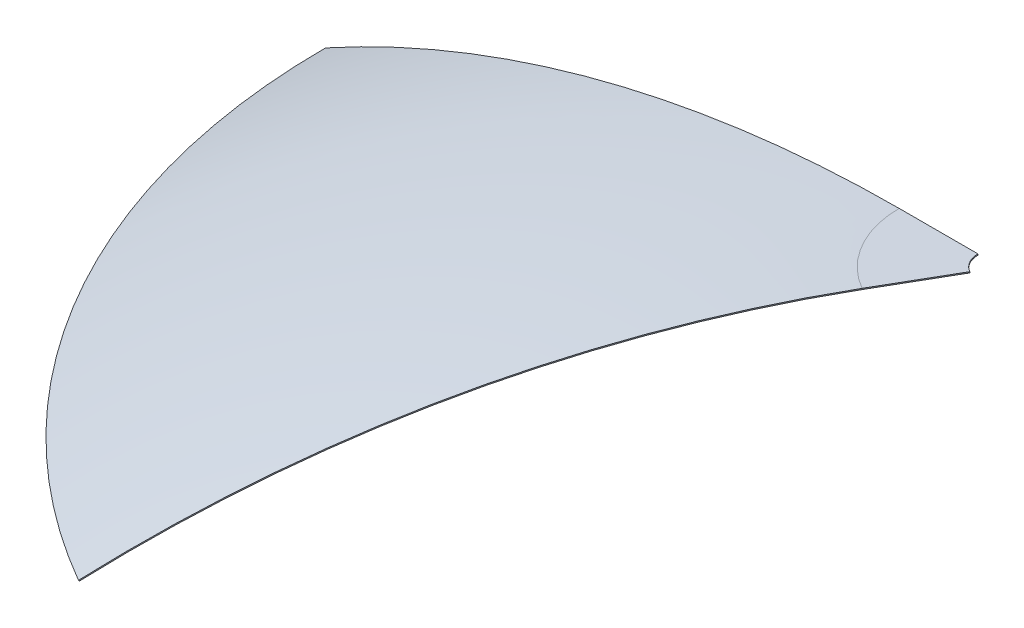
ISO-10303-21;
HEADER;
FILE_DESCRIPTION(('STEP AP214'),'2;1');
FILE_NAME('part.step','',(''),(''),'','','');
FILE_SCHEMA(('AUTOMOTIVE_DESIGN { 1 0 10303 214 1 1 1 1 }'));
ENDSEC;
DATA;
#1=APPLICATION_CONTEXT('core data for automotive mechanical design processes');
#2=APPLICATION_PROTOCOL_DEFINITION('international standard','automotive_design',2000,#1);
#3=PRODUCT_CONTEXT('',#1,'mechanical');
#4=PRODUCT('Part','Part','',(#3));
#5=PRODUCT_RELATED_PRODUCT_CATEGORY('part','',(#4));
#6=PRODUCT_DEFINITION_FORMATION('','',#4);
#7=PRODUCT_DEFINITION_CONTEXT('part definition',#1,'design');
#8=PRODUCT_DEFINITION('design','',#6,#7);
#9=PRODUCT_DEFINITION_SHAPE('','',#8);
#10=(LENGTH_UNIT() NAMED_UNIT(*) SI_UNIT(.MILLI.,.METRE.));
#11=(NAMED_UNIT(*) PLANE_ANGLE_UNIT() SI_UNIT($,.RADIAN.));
#12=(NAMED_UNIT(*) SI_UNIT($,.STERADIAN.) SOLID_ANGLE_UNIT());
#13=UNCERTAINTY_MEASURE_WITH_UNIT(LENGTH_MEASURE(1.E-05),#10,'distance_accuracy_value','');
#14=(GEOMETRIC_REPRESENTATION_CONTEXT(3) GLOBAL_UNCERTAINTY_ASSIGNED_CONTEXT((#13)) GLOBAL_UNIT_ASSIGNED_CONTEXT((#10,
#11,#12)) REPRESENTATION_CONTEXT('',''));
#15=CARTESIAN_POINT('',(0.,0.,0.));
#16=DIRECTION('',(0.,0.,1.));
#17=DIRECTION('',(1.,0.,0.));
#18=AXIS2_PLACEMENT_3D('',#15,#16,#17);
#19=CARTESIAN_POINT('',(-22.4999999999966,1.93667367262545,38.971143170294));
#20=DIRECTION('',(0.,1.,0.));
#21=DIRECTION('',(-1.,0.,0.));
#22=AXIS2_PLACEMENT_3D('',#19,#20,#21);
#23=PLANE('',#22);
#24=CARTESIAN_POINT('',(0.,1.93667367262551,0.));
#25=DIRECTION('',(0.,-1.,0.));
#26=DIRECTION('',(1.,0.,0.));
#27=AXIS2_PLACEMENT_3D('',#24,#25,#26);
#28=CIRCLE('',#27,9.99999999999332);
#29=CARTESIAN_POINT('',(-4.99999999999664,1.93667367262545,8.66025403783862));
#30=VERTEX_POINT('',#29);
#31=CARTESIAN_POINT('',(-9.99999999999332,1.93667367262543,0.));
#32=VERTEX_POINT('',#31);
#33=EDGE_CURVE('E52',#30,#32,#28,.T.);
#34=ORIENTED_EDGE('',*,*,#33,.F.);
#35=DIRECTION('',(0.499999999999998,0.,-0.86602540378444));
#36=VECTOR('',#35,1.);
#37=CARTESIAN_POINT('',(-22.4999999999966,1.93667367262551,38.971143170294));
#38=LINE('',#37,#36);
#39=CARTESIAN_POINT('',(-22.4999999999966,1.93667367262551,38.971143170294));
#40=VERTEX_POINT('',#39);
#41=EDGE_CURVE('E113',#40,#30,#38,.T.);
#42=ORIENTED_EDGE('',*,*,#41,.F.);
#43=CARTESIAN_POINT('',(0.,1.93667367262551,0.));
#44=DIRECTION('',(0.,-1.,0.));
#45=DIRECTION('',(1.,0.,0.));
#46=AXIS2_PLACEMENT_3D('',#43,#44,#45);
#47=CIRCLE('',#46,44.9999999999933);
#48=CARTESIAN_POINT('',(-44.9999999999933,1.93667367262543,0.));
#49=VERTEX_POINT('',#48);
#50=EDGE_CURVE('E11',#40,#49,#47,.T.);
#51=ORIENTED_EDGE('',*,*,#50,.T.);
#52=DIRECTION('',(1.,0.,0.));
#53=VECTOR('',#52,1.);
#54=CARTESIAN_POINT('',(-44.9999999999933,1.93667367262543,0.));
#55=LINE('',#54,#53);
#56=EDGE_CURVE('E110',#49,#32,#55,.T.);
#57=ORIENTED_EDGE('',*,*,#56,.T.);
#58=EDGE_LOOP('',(#34,#42,#51,#57));
#59=FACE_BOUND('',#58,.T.);
#60=ADVANCED_FACE('F44',(#59),#23,.F.);
#61=CARTESIAN_POINT('',(3.43024899888577E-12,-998.5,0.));
#62=DIRECTION('',(0.,-1.,0.));
#63=DIRECTION('',(1.,0.,0.));
#64=AXIS2_PLACEMENT_3D('',#61,#62,#63);
#65=CYLINDRICAL_SURFACE('',#64,9.99999999999332);
#66=CARTESIAN_POINT('',(0.,2.43667367262546,0.));
#67=DIRECTION('',(0.,-1.,0.));
#68=DIRECTION('',(1.,0.,0.));
#69=AXIS2_PLACEMENT_3D('',#66,#67,#68);
#70=CIRCLE('',#69,9.99999999999332);
#71=CARTESIAN_POINT('',(-4.99999999999664,2.43667367262545,8.66025403783861));
#72=VERTEX_POINT('',#71);
#73=CARTESIAN_POINT('',(-9.99999999999332,2.43667367262543,0.));
#74=VERTEX_POINT('',#73);
#75=EDGE_CURVE('E157',#72,#74,#70,.T.);
#76=ORIENTED_EDGE('',*,*,#75,.F.);
#77=DIRECTION('',(0.,1.,0.));
#78=VECTOR('',#77,1.);
#79=CARTESIAN_POINT('',(-4.99999999999664,2.43667367262545,8.66025403783861));
#80=LINE('',#79,#78);
#81=EDGE_CURVE('E136',#30,#72,#80,.T.);
#82=ORIENTED_EDGE('',*,*,#81,.F.);
#83=ORIENTED_EDGE('',*,*,#33,.T.);
#84=DIRECTION('',(0.,1.,0.));
#85=VECTOR('',#84,1.);
#86=CARTESIAN_POINT('',(-9.99999999999332,2.43667367262543,0.));
#87=LINE('',#86,#85);
#88=EDGE_CURVE('E117',#32,#74,#87,.T.);
#89=ORIENTED_EDGE('',*,*,#88,.T.);
#90=EDGE_LOOP('',(#76,#82,#83,#89));
#91=FACE_BOUND('',#90,.T.);
#92=ADVANCED_FACE('F162',(#91),#65,.F.);
#93=CARTESIAN_POINT('',(-22.5001879266069,2.43667367262546,38.9714686687312));
#94=DIRECTION('',(0.,-1.,0.));
#95=DIRECTION('',(1.,0.,0.));
#96=AXIS2_PLACEMENT_3D('',#93,#94,#95);
#97=PLANE('',#96);
#98=CARTESIAN_POINT('',(0.,2.43667367262546,0.));
#99=DIRECTION('',(0.,-1.,0.));
#100=DIRECTION('',(1.,0.,0.));
#101=AXIS2_PLACEMENT_3D('',#98,#99,#100);
#102=CIRCLE('',#101,45.000375853214);
#103=CARTESIAN_POINT('',(-22.5001879266069,2.43667367262553,38.9714686687312));
#104=VERTEX_POINT('',#103);
#105=CARTESIAN_POINT('',(-45.000375853214,2.43667367262546,0.));
#106=VERTEX_POINT('',#105);
#107=EDGE_CURVE('E154',#104,#106,#102,.T.);
#108=ORIENTED_EDGE('',*,*,#107,.F.);
#109=DIRECTION('',(-0.499999999999998,0.,0.86602540378444));
#110=VECTOR('',#109,1.);
#111=CARTESIAN_POINT('',(-22.5001879266069,2.43667367262553,38.9714686687312));
#112=LINE('',#111,#110);
#113=EDGE_CURVE('E140',#72,#104,#112,.T.);
#114=ORIENTED_EDGE('',*,*,#113,.F.);
#115=ORIENTED_EDGE('',*,*,#75,.T.);
#116=DIRECTION('',(-1.,0.,0.));
#117=VECTOR('',#116,1.);
#118=CARTESIAN_POINT('',(-45.000375853214,2.43667367262546,0.));
#119=LINE('',#118,#117);
#120=EDGE_CURVE('E121',#74,#106,#119,.T.);
#121=ORIENTED_EDGE('',*,*,#120,.T.);
#122=EDGE_LOOP('',(#108,#114,#115,#121));
#123=FACE_BOUND('',#122,.T.);
#124=ADVANCED_FACE('F172',(#123),#97,.F.);
#125=CARTESIAN_POINT('',(1.81799020282369E-12,-527.726621377636,0.));
#126=DIRECTION('',(0.,-1.,0.));
#127=DIRECTION('',(1.,0.,0.));
#128=AXIS2_PLACEMENT_3D('',#125,#126,#127);
#129=DEGENERATE_TOROIDAL_SURFACE('',#128,44.2035089927371,530.163893918988,.T.);
#130=CARTESIAN_POINT('',(2.21974962611907E-13,-63.2110348793953,0.));
#131=DIRECTION('',(0.,-1.,0.));
#132=DIRECTION('',(1.,0.,0.));
#133=AXIS2_PLACEMENT_3D('',#130,#131,#132);
#134=CIRCLE('',#133,299.740246695048);
#135=CARTESIAN_POINT('',(-149.870123347523,-63.2110348793959,259.582668174526));
#136=VERTEX_POINT('',#135);
#137=CARTESIAN_POINT('',(-299.740246695048,-63.2110348793964,0.));
#138=VERTEX_POINT('',#137);
#139=EDGE_CURVE('E150',#136,#138,#134,.T.);
#140=ORIENTED_EDGE('',*,*,#139,.F.);
#141=CARTESIAN_POINT('',(-22.1017544963666,-527.726621377636,38.2813617241243));
#142=DIRECTION('',(0.86602540378444,0.,0.499999999999998));
#143=DIRECTION('',(0.499999999999998,0.,-0.86602540378444));
#144=AXIS2_PLACEMENT_3D('',#141,#142,#143);
#145=CIRCLE('',#144,530.163893918988);
#146=EDGE_CURVE('E67',#104,#136,#145,.T.);
#147=ORIENTED_EDGE('',*,*,#146,.F.);
#148=ORIENTED_EDGE('',*,*,#107,.T.);
#149=CARTESIAN_POINT('',(-44.2035089927353,-527.726621377636,0.));
#150=DIRECTION('',(0.,0.,1.));
#151=DIRECTION('',(1.,0.,0.));
#152=AXIS2_PLACEMENT_3D('',#149,#150,#151);
#153=CIRCLE('',#152,530.163893918988);
#154=EDGE_CURVE('E127',#106,#138,#153,.T.);
#155=ORIENTED_EDGE('',*,*,#154,.T.);
#156=EDGE_LOOP('',(#140,#147,#148,#155));
#157=FACE_BOUND('',#156,.T.);
#158=ADVANCED_FACE('F170',(#157),#129,.T.);
#159=CARTESIAN_POINT('',(2.21974962611907E-13,-63.2110348793953,0.));
#160=DIRECTION('',(0.,1.,0.));
#161=DIRECTION('',(-1.,0.,0.));
#162=AXIS2_PLACEMENT_3D('',#159,#160,#161);
#163=CONICAL_SURFACE('',#162,299.740246695048,0.50293107834379);
#164=CARTESIAN_POINT('',(2.23477709351008E-13,-63.6491216595646,0.));
#165=DIRECTION('',(0.,-1.,0.));
#166=DIRECTION('',(1.,0.,0.));
#167=AXIS2_PLACEMENT_3D('',#164,#165,#166);
#168=CIRCLE('',#167,299.499248825678);
#169=CARTESIAN_POINT('',(-149.749624412838,-63.6491216595651,259.373957897394));
#170=VERTEX_POINT('',#169);
#171=CARTESIAN_POINT('',(-299.499248825678,-63.6491216595657,0.));
#172=VERTEX_POINT('',#171);
#173=EDGE_CURVE('E99',#170,#172,#168,.T.);
#174=ORIENTED_EDGE('',*,*,#173,.F.);
#175=DIRECTION('',(0.240997869369592,-0.876173560339086,-0.417420554263978));
#176=VECTOR('',#175,1.);
#177=CARTESIAN_POINT('',(-149.870123347523,-63.2110348793959,259.582668174526));
#178=LINE('',#177,#176);
#179=EDGE_CURVE('E145',#136,#170,#178,.T.);
#180=ORIENTED_EDGE('',*,*,#179,.F.);
#181=ORIENTED_EDGE('',*,*,#139,.T.);
#182=DIRECTION('',(0.481995738739184,-0.876173560339085,0.));
#183=VECTOR('',#182,1.);
#184=CARTESIAN_POINT('',(-299.740246695048,-63.2110348793964,0.));
#185=LINE('',#184,#183);
#186=EDGE_CURVE('E105',#138,#172,#185,.T.);
#187=ORIENTED_EDGE('',*,*,#186,.T.);
#188=EDGE_LOOP('',(#174,#180,#181,#187));
#189=FACE_BOUND('',#188,.T.);
#190=ADVANCED_FACE('F167',(#189),#163,.T.);
#191=CARTESIAN_POINT('',(1.81799020282369E-12,-527.726621377636,0.));
#192=DIRECTION('',(0.,-1.,0.));
#193=DIRECTION('',(1.,0.,0.));
#194=AXIS2_PLACEMENT_3D('',#191,#192,#193);
#195=DEGENERATE_TOROIDAL_SURFACE('',#194,44.2035089927371,529.663893918988,.T.);
#196=CARTESIAN_POINT('',(-22.1017544963666,-527.726621377636,38.2813617241243));
#197=DIRECTION('',(-0.86602540378444,0.,-0.499999999999998));
#198=DIRECTION('',(0.499999999999998,0.,-0.86602540378444));
#199=AXIS2_PLACEMENT_3D('',#196,#197,#198);
#200=CIRCLE('',#199,529.663893918988);
#201=EDGE_CURVE('E59',#170,#40,#200,.T.);
#202=ORIENTED_EDGE('',*,*,#201,.F.);
#203=ORIENTED_EDGE('',*,*,#173,.T.);
#204=CARTESIAN_POINT('',(-44.2035089927353,-527.726621377636,0.));
#205=DIRECTION('',(0.,0.,-1.));
#206=DIRECTION('',(1.,0.,0.));
#207=AXIS2_PLACEMENT_3D('',#204,#205,#206);
#208=CIRCLE('',#207,529.663893918988);
#209=EDGE_CURVE('E97',#172,#49,#208,.T.);
#210=ORIENTED_EDGE('',*,*,#209,.T.);
#211=ORIENTED_EDGE('',*,*,#50,.F.);
#212=EDGE_LOOP('',(#202,#203,#210,#211));
#213=FACE_BOUND('',#212,.T.);
#214=ADVANCED_FACE('F98',(#213),#195,.F.);
#215=CARTESIAN_POINT('',(-22.1017544963666,-527.726621377636,38.2813617241243));
#216=DIRECTION('',(0.86602540378444,0.,0.499999999999998));
#217=DIRECTION('',(0.499999999999998,0.,-0.86602540378444));
#218=AXIS2_PLACEMENT_3D('',#215,#216,#217);
#219=PLANE('',#218);
#220=ORIENTED_EDGE('',*,*,#201,.T.);
#221=ORIENTED_EDGE('',*,*,#41,.T.);
#222=ORIENTED_EDGE('',*,*,#81,.T.);
#223=ORIENTED_EDGE('',*,*,#113,.T.);
#224=ORIENTED_EDGE('',*,*,#146,.T.);
#225=ORIENTED_EDGE('',*,*,#179,.T.);
#226=EDGE_LOOP('',(#220,#221,#222,#223,#224,#225));
#227=FACE_BOUND('',#226,.T.);
#228=ADVANCED_FACE('F163',(#227),#219,.T.);
#229=CARTESIAN_POINT('',(-44.2035089927353,-527.726621377636,0.));
#230=DIRECTION('',(0.,0.,1.));
#231=DIRECTION('',(1.,0.,0.));
#232=AXIS2_PLACEMENT_3D('',#229,#230,#231);
#233=PLANE('',#232);
#234=ORIENTED_EDGE('',*,*,#56,.F.);
#235=ORIENTED_EDGE('',*,*,#209,.F.);
#236=ORIENTED_EDGE('',*,*,#186,.F.);
#237=ORIENTED_EDGE('',*,*,#154,.F.);
#238=ORIENTED_EDGE('',*,*,#120,.F.);
#239=ORIENTED_EDGE('',*,*,#88,.F.);
#240=EDGE_LOOP('',(#234,#235,#236,#237,#238,#239));
#241=FACE_BOUND('',#240,.T.);
#242=ADVANCED_FACE('F114',(#241),#233,.F.);
#243=CLOSED_SHELL('',(#60,#92,#124,#158,#190,#214,#228,#242));
#244=MANIFOLD_SOLID_BREP('B2',#243);
#245=ADVANCED_BREP_SHAPE_REPRESENTATION('',(#18,#244),#14);
#246=SHAPE_DEFINITION_REPRESENTATION(#9,#245);
ENDSEC;
END-ISO-10303-21;
